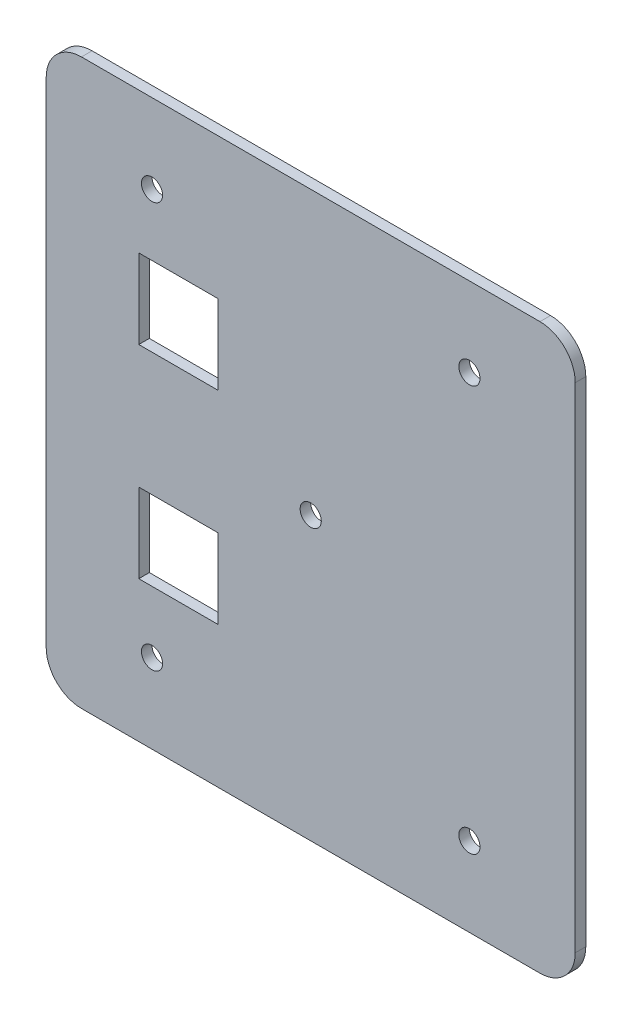
ISO-10303-21;
HEADER;
FILE_DESCRIPTION(('STEP AP214'),'2;1');
FILE_NAME('part.step','',(''),(''),'','','');
FILE_SCHEMA(('AUTOMOTIVE_DESIGN { 1 0 10303 214 1 1 1 1 }'));
ENDSEC;
DATA;
#1=APPLICATION_CONTEXT('core data for automotive mechanical design processes');
#2=APPLICATION_PROTOCOL_DEFINITION('international standard','automotive_design',2000,#1);
#3=PRODUCT_CONTEXT('',#1,'mechanical');
#4=PRODUCT('Part','Part','',(#3));
#5=PRODUCT_RELATED_PRODUCT_CATEGORY('part','',(#4));
#6=PRODUCT_DEFINITION_FORMATION('','',#4);
#7=PRODUCT_DEFINITION_CONTEXT('part definition',#1,'design');
#8=PRODUCT_DEFINITION('design','',#6,#7);
#9=PRODUCT_DEFINITION_SHAPE('','',#8);
#10=(LENGTH_UNIT() NAMED_UNIT(*) SI_UNIT(.MILLI.,.METRE.));
#11=(NAMED_UNIT(*) PLANE_ANGLE_UNIT() SI_UNIT($,.RADIAN.));
#12=(NAMED_UNIT(*) SI_UNIT($,.STERADIAN.) SOLID_ANGLE_UNIT());
#13=UNCERTAINTY_MEASURE_WITH_UNIT(LENGTH_MEASURE(1.E-05),#10,'distance_accuracy_value','');
#14=(GEOMETRIC_REPRESENTATION_CONTEXT(3) GLOBAL_UNCERTAINTY_ASSIGNED_CONTEXT((#13)) GLOBAL_UNIT_ASSIGNED_CONTEXT((#10,
#11,#12)) REPRESENTATION_CONTEXT('',''));
#15=CARTESIAN_POINT('',(0.,0.,0.));
#16=DIRECTION('',(0.,0.,1.));
#17=DIRECTION('',(1.,0.,0.));
#18=AXIS2_PLACEMENT_3D('',#15,#16,#17);
#19=CARTESIAN_POINT('',(-22.5,0.,6.));
#20=DIRECTION('',(1.,0.,0.));
#21=DIRECTION('',(0.,1.,0.));
#22=AXIS2_PLACEMENT_3D('',#19,#20,#21);
#23=PLANE('',#22);
#24=DIRECTION('',(0.,-1.,0.));
#25=VECTOR('',#24,1.);
#26=CARTESIAN_POINT('',(-22.5,0.,0.));
#27=LINE('',#26,#25);
#28=CARTESIAN_POINT('',(-22.5,22.5,0.));
#29=VERTEX_POINT('',#28);
#30=CARTESIAN_POINT('',(-22.5,-22.5,0.));
#31=VERTEX_POINT('',#30);
#32=EDGE_CURVE('E233',#29,#31,#27,.T.);
#33=ORIENTED_EDGE('',*,*,#32,.F.);
#34=DIRECTION('',(0.,0.,-1.));
#35=VECTOR('',#34,1.);
#36=CARTESIAN_POINT('',(-22.5,22.5,6.));
#37=LINE('',#36,#35);
#38=CARTESIAN_POINT('',(-22.5,22.5,6.));
#39=VERTEX_POINT('',#38);
#40=EDGE_CURVE('E11',#39,#29,#37,.T.);
#41=ORIENTED_EDGE('',*,*,#40,.F.);
#42=DIRECTION('',(0.,-1.,0.));
#43=VECTOR('',#42,1.);
#44=CARTESIAN_POINT('',(-22.5,0.,6.));
#45=LINE('',#44,#43);
#46=CARTESIAN_POINT('',(-22.5,-22.5,6.));
#47=VERTEX_POINT('',#46);
#48=EDGE_CURVE('E176',#39,#47,#45,.T.);
#49=ORIENTED_EDGE('',*,*,#48,.T.);
#50=DIRECTION('',(0.,0.,-1.));
#51=VECTOR('',#50,1.);
#52=CARTESIAN_POINT('',(-22.5,-22.5,6.));
#53=LINE('',#52,#51);
#54=EDGE_CURVE('E60',#47,#31,#53,.T.);
#55=ORIENTED_EDGE('',*,*,#54,.T.);
#56=EDGE_LOOP('',(#33,#41,#49,#55));
#57=FACE_BOUND('',#56,.T.);
#58=ADVANCED_FACE('F41',(#57),#23,.T.);
#59=CARTESIAN_POINT('',(0.,22.5,6.));
#60=DIRECTION('',(0.,-1.,0.));
#61=DIRECTION('',(0.,0.,-1.));
#62=AXIS2_PLACEMENT_3D('',#59,#60,#61);
#63=PLANE('',#62);
#64=DIRECTION('',(-1.,0.,0.));
#65=VECTOR('',#64,1.);
#66=CARTESIAN_POINT('',(0.,22.5,0.));
#67=LINE('',#66,#65);
#68=CARTESIAN_POINT('',(22.5,22.5,0.));
#69=VERTEX_POINT('',#68);
#70=EDGE_CURVE('E165',#69,#29,#67,.T.);
#71=ORIENTED_EDGE('',*,*,#70,.F.);
#72=DIRECTION('',(0.,0.,-1.));
#73=VECTOR('',#72,1.);
#74=CARTESIAN_POINT('',(22.5,22.5,6.));
#75=LINE('',#74,#73);
#76=CARTESIAN_POINT('',(22.5,22.5,6.));
#77=VERTEX_POINT('',#76);
#78=EDGE_CURVE('E51',#77,#69,#75,.T.);
#79=ORIENTED_EDGE('',*,*,#78,.F.);
#80=DIRECTION('',(-1.,0.,0.));
#81=VECTOR('',#80,1.);
#82=CARTESIAN_POINT('',(0.,22.5,6.));
#83=LINE('',#82,#81);
#84=EDGE_CURVE('E163',#77,#39,#83,.T.);
#85=ORIENTED_EDGE('',*,*,#84,.T.);
#86=ORIENTED_EDGE('',*,*,#40,.T.);
#87=EDGE_LOOP('',(#71,#79,#85,#86));
#88=FACE_BOUND('',#87,.T.);
#89=ADVANCED_FACE('F162',(#88),#63,.T.);
#90=CARTESIAN_POINT('',(22.5,0.,6.));
#91=DIRECTION('',(-1.,0.,0.));
#92=DIRECTION('',(0.,-1.,0.));
#93=AXIS2_PLACEMENT_3D('',#90,#91,#92);
#94=PLANE('',#93);
#95=DIRECTION('',(0.,1.,0.));
#96=VECTOR('',#95,1.);
#97=CARTESIAN_POINT('',(22.5,0.,0.));
#98=LINE('',#97,#96);
#99=CARTESIAN_POINT('',(22.5,-22.5,0.));
#100=VERTEX_POINT('',#99);
#101=EDGE_CURVE('E236',#100,#69,#98,.T.);
#102=ORIENTED_EDGE('',*,*,#101,.F.);
#103=DIRECTION('',(0.,0.,-1.));
#104=VECTOR('',#103,1.);
#105=CARTESIAN_POINT('',(22.5,-22.5,6.));
#106=LINE('',#105,#104);
#107=CARTESIAN_POINT('',(22.5,-22.5,6.));
#108=VERTEX_POINT('',#107);
#109=EDGE_CURVE('E109',#108,#100,#106,.T.);
#110=ORIENTED_EDGE('',*,*,#109,.F.);
#111=DIRECTION('',(0.,1.,0.));
#112=VECTOR('',#111,1.);
#113=CARTESIAN_POINT('',(22.5,0.,6.));
#114=LINE('',#113,#112);
#115=EDGE_CURVE('E175',#108,#77,#114,.T.);
#116=ORIENTED_EDGE('',*,*,#115,.T.);
#117=ORIENTED_EDGE('',*,*,#78,.T.);
#118=EDGE_LOOP('',(#102,#110,#116,#117));
#119=FACE_BOUND('',#118,.T.);
#120=ADVANCED_FACE('F178',(#119),#94,.T.);
#121=CARTESIAN_POINT('',(0.,92.5,6.));
#122=DIRECTION('',(0.,1.,0.));
#123=DIRECTION('',(0.,0.,1.));
#124=AXIS2_PLACEMENT_3D('',#121,#122,#123);
#125=PLANE('',#124);
#126=DIRECTION('',(1.,0.,0.));
#127=VECTOR('',#126,1.);
#128=CARTESIAN_POINT('',(0.,92.5,0.));
#129=LINE('',#128,#127);
#130=CARTESIAN_POINT('',(-22.5,92.5,0.));
#131=VERTEX_POINT('',#130);
#132=CARTESIAN_POINT('',(22.5,92.5,0.));
#133=VERTEX_POINT('',#132);
#134=EDGE_CURVE('E221',#131,#133,#129,.T.);
#135=ORIENTED_EDGE('',*,*,#134,.F.);
#136=DIRECTION('',(0.,0.,-1.));
#137=VECTOR('',#136,1.);
#138=CARTESIAN_POINT('',(-22.5,92.5,6.));
#139=LINE('',#138,#137);
#140=CARTESIAN_POINT('',(-22.5,92.5,6.));
#141=VERTEX_POINT('',#140);
#142=EDGE_CURVE('E243',#141,#131,#139,.T.);
#143=ORIENTED_EDGE('',*,*,#142,.F.);
#144=DIRECTION('',(1.,0.,0.));
#145=VECTOR('',#144,1.);
#146=CARTESIAN_POINT('',(0.,92.5,6.));
#147=LINE('',#146,#145);
#148=CARTESIAN_POINT('',(22.5,92.5,6.));
#149=VERTEX_POINT('',#148);
#150=EDGE_CURVE('E321',#141,#149,#147,.T.);
#151=ORIENTED_EDGE('',*,*,#150,.T.);
#152=DIRECTION('',(0.,0.,-1.));
#153=VECTOR('',#152,1.);
#154=CARTESIAN_POINT('',(22.5,92.5,6.));
#155=LINE('',#154,#153);
#156=EDGE_CURVE('E245',#149,#133,#155,.T.);
#157=ORIENTED_EDGE('',*,*,#156,.T.);
#158=EDGE_LOOP('',(#135,#143,#151,#157));
#159=FACE_BOUND('',#158,.T.);
#160=ADVANCED_FACE('F366',(#159),#125,.T.);
#161=CARTESIAN_POINT('',(-22.5,0.,6.));
#162=DIRECTION('',(1.,0.,0.));
#163=DIRECTION('',(0.,1.,0.));
#164=AXIS2_PLACEMENT_3D('',#161,#162,#163);
#165=PLANE('',#164);
#166=DIRECTION('',(0.,-1.,0.));
#167=VECTOR('',#166,1.);
#168=CARTESIAN_POINT('',(-22.5,0.,0.));
#169=LINE('',#168,#167);
#170=CARTESIAN_POINT('',(-22.5,137.5,0.));
#171=VERTEX_POINT('',#170);
#172=EDGE_CURVE('E224',#171,#131,#169,.T.);
#173=ORIENTED_EDGE('',*,*,#172,.F.);
#174=DIRECTION('',(0.,0.,-1.));
#175=VECTOR('',#174,1.);
#176=CARTESIAN_POINT('',(-22.5,137.5,6.));
#177=LINE('',#176,#175);
#178=CARTESIAN_POINT('',(-22.5,137.5,6.));
#179=VERTEX_POINT('',#178);
#180=EDGE_CURVE('E249',#179,#171,#177,.T.);
#181=ORIENTED_EDGE('',*,*,#180,.F.);
#182=DIRECTION('',(0.,-1.,0.));
#183=VECTOR('',#182,1.);
#184=CARTESIAN_POINT('',(-22.5,0.,6.));
#185=LINE('',#184,#183);
#186=EDGE_CURVE('E324',#179,#141,#185,.T.);
#187=ORIENTED_EDGE('',*,*,#186,.T.);
#188=ORIENTED_EDGE('',*,*,#142,.T.);
#189=EDGE_LOOP('',(#173,#181,#187,#188));
#190=FACE_BOUND('',#189,.T.);
#191=ADVANCED_FACE('F362',(#190),#165,.T.);
#192=CARTESIAN_POINT('',(0.,137.5,6.));
#193=DIRECTION('',(0.,-1.,0.));
#194=DIRECTION('',(0.,0.,-1.));
#195=AXIS2_PLACEMENT_3D('',#192,#193,#194);
#196=PLANE('',#195);
#197=DIRECTION('',(-1.,0.,0.));
#198=VECTOR('',#197,1.);
#199=CARTESIAN_POINT('',(0.,137.5,0.));
#200=LINE('',#199,#198);
#201=CARTESIAN_POINT('',(22.5,137.5,0.));
#202=VERTEX_POINT('',#201);
#203=EDGE_CURVE('E227',#202,#171,#200,.T.);
#204=ORIENTED_EDGE('',*,*,#203,.F.);
#205=DIRECTION('',(0.,0.,-1.));
#206=VECTOR('',#205,1.);
#207=CARTESIAN_POINT('',(22.5,137.5,6.));
#208=LINE('',#207,#206);
#209=CARTESIAN_POINT('',(22.5,137.5,6.));
#210=VERTEX_POINT('',#209);
#211=EDGE_CURVE('E247',#210,#202,#208,.T.);
#212=ORIENTED_EDGE('',*,*,#211,.F.);
#213=DIRECTION('',(-1.,0.,0.));
#214=VECTOR('',#213,1.);
#215=CARTESIAN_POINT('',(0.,137.5,6.));
#216=LINE('',#215,#214);
#217=EDGE_CURVE('E327',#210,#179,#216,.T.);
#218=ORIENTED_EDGE('',*,*,#217,.T.);
#219=ORIENTED_EDGE('',*,*,#180,.T.);
#220=EDGE_LOOP('',(#204,#212,#218,#219));
#221=FACE_BOUND('',#220,.T.);
#222=ADVANCED_FACE('F359',(#221),#196,.T.);
#223=CARTESIAN_POINT('',(0.,217.5,6.));
#224=DIRECTION('',(0.,1.,0.));
#225=DIRECTION('',(-1.,0.,0.));
#226=AXIS2_PLACEMENT_3D('',#223,#224,#225);
#227=PLANE('',#226);
#228=DIRECTION('',(1.,0.,0.));
#229=VECTOR('',#228,1.);
#230=CARTESIAN_POINT('',(0.,217.5,0.));
#231=LINE('',#230,#229);
#232=CARTESIAN_POINT('',(-54.9999999999999,217.5,0.));
#233=VERTEX_POINT('',#232);
#234=CARTESIAN_POINT('',(205.,217.5,0.));
#235=VERTEX_POINT('',#234);
#236=EDGE_CURVE('E185',#233,#235,#231,.T.);
#237=ORIENTED_EDGE('',*,*,#236,.F.);
#238=DIRECTION('',(0.,0.,-1.));
#239=VECTOR('',#238,1.);
#240=CARTESIAN_POINT('',(-54.9999999999999,217.5,6.));
#241=LINE('',#240,#239);
#242=CARTESIAN_POINT('',(-54.9999999999999,217.5,6.));
#243=VERTEX_POINT('',#242);
#244=EDGE_CURVE('E45',#243,#233,#241,.T.);
#245=ORIENTED_EDGE('',*,*,#244,.F.);
#246=DIRECTION('',(1.,0.,0.));
#247=VECTOR('',#246,1.);
#248=CARTESIAN_POINT('',(0.,217.5,6.));
#249=LINE('',#248,#247);
#250=CARTESIAN_POINT('',(205.,217.5,6.));
#251=VERTEX_POINT('',#250);
#252=EDGE_CURVE('E241',#243,#251,#249,.T.);
#253=ORIENTED_EDGE('',*,*,#252,.T.);
#254=DIRECTION('',(0.,0.,-1.));
#255=VECTOR('',#254,1.);
#256=CARTESIAN_POINT('',(205.,217.5,6.));
#257=LINE('',#256,#255);
#258=EDGE_CURVE('E181',#251,#235,#257,.T.);
#259=ORIENTED_EDGE('',*,*,#258,.T.);
#260=EDGE_LOOP('',(#237,#245,#253,#259));
#261=FACE_BOUND('',#260,.T.);
#262=ADVANCED_FACE('F43',(#261),#227,.T.);
#263=CARTESIAN_POINT('',(-55.,197.5,6.));
#264=DIRECTION('',(0.,0.,-1.));
#265=DIRECTION('',(-1.,0.,0.));
#266=AXIS2_PLACEMENT_3D('',#263,#264,#265);
#267=CYLINDRICAL_SURFACE('',#266,20.);
#268=CARTESIAN_POINT('',(-55.,197.5,0.));
#269=DIRECTION('',(0.,0.,1.));
#270=DIRECTION('',(1.,0.,0.));
#271=AXIS2_PLACEMENT_3D('',#268,#269,#270);
#272=CIRCLE('',#271,20.);
#273=CARTESIAN_POINT('',(-75.,197.5,0.));
#274=VERTEX_POINT('',#273);
#275=EDGE_CURVE('E188',#274,#233,#272,.F.);
#276=ORIENTED_EDGE('',*,*,#275,.F.);
#277=DIRECTION('',(0.,0.,-1.));
#278=VECTOR('',#277,1.);
#279=CARTESIAN_POINT('',(-75.,197.5,6.));
#280=LINE('',#279,#278);
#281=CARTESIAN_POINT('',(-75.,197.5,6.));
#282=VERTEX_POINT('',#281);
#283=EDGE_CURVE('E265',#282,#274,#280,.T.);
#284=ORIENTED_EDGE('',*,*,#283,.F.);
#285=CARTESIAN_POINT('',(-55.,197.5,6.));
#286=DIRECTION('',(0.,0.,1.));
#287=DIRECTION('',(1.,0.,0.));
#288=AXIS2_PLACEMENT_3D('',#285,#286,#287);
#289=CIRCLE('',#288,20.);
#290=EDGE_CURVE('E274',#282,#243,#289,.F.);
#291=ORIENTED_EDGE('',*,*,#290,.T.);
#292=ORIENTED_EDGE('',*,*,#244,.T.);
#293=EDGE_LOOP('',(#276,#284,#291,#292));
#294=FACE_BOUND('',#293,.T.);
#295=ADVANCED_FACE('F272',(#294),#267,.T.);
#296=CARTESIAN_POINT('',(-75.,0.,6.));
#297=DIRECTION('',(-1.,0.,0.));
#298=DIRECTION('',(0.,-1.,0.));
#299=AXIS2_PLACEMENT_3D('',#296,#297,#298);
#300=PLANE('',#299);
#301=DIRECTION('',(0.,1.,0.));
#302=VECTOR('',#301,1.);
#303=CARTESIAN_POINT('',(-75.,0.,0.));
#304=LINE('',#303,#302);
#305=CARTESIAN_POINT('',(-75.,-82.4999999999998,0.));
#306=VERTEX_POINT('',#305);
#307=EDGE_CURVE('E191',#306,#274,#304,.T.);
#308=ORIENTED_EDGE('',*,*,#307,.F.);
#309=DIRECTION('',(0.,0.,-1.));
#310=VECTOR('',#309,1.);
#311=CARTESIAN_POINT('',(-75.,-82.4999999999998,6.));
#312=LINE('',#311,#310);
#313=CARTESIAN_POINT('',(-75.,-82.4999999999998,6.));
#314=VERTEX_POINT('',#313);
#315=EDGE_CURVE('E264',#314,#306,#312,.T.);
#316=ORIENTED_EDGE('',*,*,#315,.F.);
#317=DIRECTION('',(0.,1.,0.));
#318=VECTOR('',#317,1.);
#319=CARTESIAN_POINT('',(-75.,0.,6.));
#320=LINE('',#319,#318);
#321=EDGE_CURVE('E284',#314,#282,#320,.T.);
#322=ORIENTED_EDGE('',*,*,#321,.T.);
#323=ORIENTED_EDGE('',*,*,#283,.T.);
#324=EDGE_LOOP('',(#308,#316,#322,#323));
#325=FACE_BOUND('',#324,.T.);
#326=ADVANCED_FACE('F281',(#325),#300,.T.);
#327=CARTESIAN_POINT('',(-55.,-82.5,6.));
#328=DIRECTION('',(0.,0.,-1.));
#329=DIRECTION('',(-1.,0.,0.));
#330=AXIS2_PLACEMENT_3D('',#327,#328,#329);
#331=CYLINDRICAL_SURFACE('',#330,20.);
#332=CARTESIAN_POINT('',(-55.,-82.5,0.));
#333=DIRECTION('',(0.,0.,1.));
#334=DIRECTION('',(1.,0.,0.));
#335=AXIS2_PLACEMENT_3D('',#332,#333,#334);
#336=CIRCLE('',#335,20.);
#337=CARTESIAN_POINT('',(-54.9999999999998,-102.5,0.));
#338=VERTEX_POINT('',#337);
#339=EDGE_CURVE('E194',#306,#338,#336,.T.);
#340=ORIENTED_EDGE('',*,*,#339,.T.);
#341=DIRECTION('',(0.,0.,-1.));
#342=VECTOR('',#341,1.);
#343=CARTESIAN_POINT('',(-54.9999999999998,-102.5,6.));
#344=LINE('',#343,#342);
#345=CARTESIAN_POINT('',(-54.9999999999998,-102.5,6.));
#346=VERTEX_POINT('',#345);
#347=EDGE_CURVE('E261',#346,#338,#344,.T.);
#348=ORIENTED_EDGE('',*,*,#347,.F.);
#349=CARTESIAN_POINT('',(-55.,-82.5,6.));
#350=DIRECTION('',(0.,0.,1.));
#351=DIRECTION('',(1.,0.,0.));
#352=AXIS2_PLACEMENT_3D('',#349,#350,#351);
#353=CIRCLE('',#352,20.);
#354=EDGE_CURVE('E287',#314,#346,#353,.T.);
#355=ORIENTED_EDGE('',*,*,#354,.F.);
#356=ORIENTED_EDGE('',*,*,#315,.T.);
#357=EDGE_LOOP('',(#340,#348,#355,#356));
#358=FACE_BOUND('',#357,.T.);
#359=ADVANCED_FACE('F288',(#358),#331,.T.);
#360=CARTESIAN_POINT('',(0.,-102.5,6.));
#361=DIRECTION('',(0.,1.,0.));
#362=DIRECTION('',(-1.,0.,0.));
#363=AXIS2_PLACEMENT_3D('',#360,#361,#362);
#364=PLANE('',#363);
#365=DIRECTION('',(1.,0.,0.));
#366=VECTOR('',#365,1.);
#367=CARTESIAN_POINT('',(0.,-102.5,0.));
#368=LINE('',#367,#366);
#369=CARTESIAN_POINT('',(205.,-102.5,0.));
#370=VERTEX_POINT('',#369);
#371=EDGE_CURVE('E196',#338,#370,#368,.T.);
#372=ORIENTED_EDGE('',*,*,#371,.T.);
#373=DIRECTION('',(0.,0.,-1.));
#374=VECTOR('',#373,1.);
#375=CARTESIAN_POINT('',(205.,-102.5,6.));
#376=LINE('',#375,#374);
#377=CARTESIAN_POINT('',(205.,-102.5,6.));
#378=VERTEX_POINT('',#377);
#379=EDGE_CURVE('E258',#378,#370,#376,.T.);
#380=ORIENTED_EDGE('',*,*,#379,.F.);
#381=DIRECTION('',(1.,0.,0.));
#382=VECTOR('',#381,1.);
#383=CARTESIAN_POINT('',(0.,-102.5,6.));
#384=LINE('',#383,#382);
#385=EDGE_CURVE('E291',#346,#378,#384,.T.);
#386=ORIENTED_EDGE('',*,*,#385,.F.);
#387=ORIENTED_EDGE('',*,*,#347,.T.);
#388=EDGE_LOOP('',(#372,#380,#386,#387));
#389=FACE_BOUND('',#388,.T.);
#390=ADVANCED_FACE('F395',(#389),#364,.F.);
#391=CARTESIAN_POINT('',(205.,-82.5,6.));
#392=DIRECTION('',(0.,0.,-1.));
#393=DIRECTION('',(-1.,0.,0.));
#394=AXIS2_PLACEMENT_3D('',#391,#392,#393);
#395=CYLINDRICAL_SURFACE('',#394,20.);
#396=CARTESIAN_POINT('',(205.,-82.5,0.));
#397=DIRECTION('',(0.,0.,1.));
#398=DIRECTION('',(1.,0.,0.));
#399=AXIS2_PLACEMENT_3D('',#396,#397,#398);
#400=CIRCLE('',#399,20.);
#401=CARTESIAN_POINT('',(225.,-82.4999999999998,0.));
#402=VERTEX_POINT('',#401);
#403=EDGE_CURVE('E198',#370,#402,#400,.T.);
#404=ORIENTED_EDGE('',*,*,#403,.T.);
#405=DIRECTION('',(0.,0.,-1.));
#406=VECTOR('',#405,1.);
#407=CARTESIAN_POINT('',(225.,-82.4999999999998,6.));
#408=LINE('',#407,#406);
#409=CARTESIAN_POINT('',(225.,-82.4999999999998,6.));
#410=VERTEX_POINT('',#409);
#411=EDGE_CURVE('E255',#410,#402,#408,.T.);
#412=ORIENTED_EDGE('',*,*,#411,.F.);
#413=CARTESIAN_POINT('',(205.,-82.5,6.));
#414=DIRECTION('',(0.,0.,1.));
#415=DIRECTION('',(1.,0.,0.));
#416=AXIS2_PLACEMENT_3D('',#413,#414,#415);
#417=CIRCLE('',#416,20.);
#418=EDGE_CURVE('E299',#378,#410,#417,.T.);
#419=ORIENTED_EDGE('',*,*,#418,.F.);
#420=ORIENTED_EDGE('',*,*,#379,.T.);
#421=EDGE_LOOP('',(#404,#412,#419,#420));
#422=FACE_BOUND('',#421,.T.);
#423=ADVANCED_FACE('F391',(#422),#395,.T.);
#424=CARTESIAN_POINT('',(225.,0.,6.));
#425=DIRECTION('',(-1.,0.,0.));
#426=DIRECTION('',(0.,0.,1.));
#427=AXIS2_PLACEMENT_3D('',#424,#425,#426);
#428=PLANE('',#427);
#429=DIRECTION('',(0.,1.,0.));
#430=VECTOR('',#429,1.);
#431=CARTESIAN_POINT('',(225.,0.,0.));
#432=LINE('',#431,#430);
#433=CARTESIAN_POINT('',(225.,197.5,0.));
#434=VERTEX_POINT('',#433);
#435=EDGE_CURVE('E200',#402,#434,#432,.T.);
#436=ORIENTED_EDGE('',*,*,#435,.T.);
#437=DIRECTION('',(0.,0.,-1.));
#438=VECTOR('',#437,1.);
#439=CARTESIAN_POINT('',(225.,197.5,6.));
#440=LINE('',#439,#438);
#441=CARTESIAN_POINT('',(225.,197.5,6.));
#442=VERTEX_POINT('',#441);
#443=EDGE_CURVE('E253',#442,#434,#440,.T.);
#444=ORIENTED_EDGE('',*,*,#443,.F.);
#445=DIRECTION('',(0.,1.,0.));
#446=VECTOR('',#445,1.);
#447=CARTESIAN_POINT('',(225.,0.,6.));
#448=LINE('',#447,#446);
#449=EDGE_CURVE('E301',#410,#442,#448,.T.);
#450=ORIENTED_EDGE('',*,*,#449,.F.);
#451=ORIENTED_EDGE('',*,*,#411,.T.);
#452=EDGE_LOOP('',(#436,#444,#450,#451));
#453=FACE_BOUND('',#452,.T.);
#454=ADVANCED_FACE('F357',(#453),#428,.F.);
#455=CARTESIAN_POINT('',(22.5,0.,6.));
#456=DIRECTION('',(-1.,0.,0.));
#457=DIRECTION('',(0.,-1.,0.));
#458=AXIS2_PLACEMENT_3D('',#455,#456,#457);
#459=PLANE('',#458);
#460=DIRECTION('',(0.,1.,0.));
#461=VECTOR('',#460,1.);
#462=CARTESIAN_POINT('',(22.5,0.,0.));
#463=LINE('',#462,#461);
#464=EDGE_CURVE('E230',#133,#202,#463,.T.);
#465=ORIENTED_EDGE('',*,*,#464,.F.);
#466=ORIENTED_EDGE('',*,*,#156,.F.);
#467=DIRECTION('',(0.,1.,0.));
#468=VECTOR('',#467,1.);
#469=CARTESIAN_POINT('',(22.5,0.,6.));
#470=LINE('',#469,#468);
#471=EDGE_CURVE('E330',#149,#210,#470,.T.);
#472=ORIENTED_EDGE('',*,*,#471,.T.);
#473=ORIENTED_EDGE('',*,*,#211,.T.);
#474=EDGE_LOOP('',(#465,#466,#472,#473));
#475=FACE_BOUND('',#474,.T.);
#476=ADVANCED_FACE('F353',(#475),#459,.T.);
#477=CARTESIAN_POINT('',(165.,172.5,6.));
#478=DIRECTION('',(0.,0.,-1.));
#479=DIRECTION('',(-1.,0.,0.));
#480=AXIS2_PLACEMENT_3D('',#477,#478,#479);
#481=CYLINDRICAL_SURFACE('',#480,6.00000000000002);
#482=CARTESIAN_POINT('',(165.,172.5,6.));
#483=DIRECTION('',(0.,0.,1.));
#484=DIRECTION('',(1.,0.,0.));
#485=AXIS2_PLACEMENT_3D('',#482,#483,#484);
#486=CIRCLE('',#485,6.00000000000002);
#487=CARTESIAN_POINT('',(171.,172.5,6.));
#488=VERTEX_POINT('',#487);
#489=EDGE_CURVE('E318',#488,#488,#486,.T.);
#490=ORIENTED_EDGE('',*,*,#489,.T.);
#491=EDGE_LOOP('',(#490));
#492=FACE_BOUND('',#491,.T.);
#493=CARTESIAN_POINT('',(165.,172.5,0.));
#494=DIRECTION('',(0.,0.,1.));
#495=DIRECTION('',(1.,0.,0.));
#496=AXIS2_PLACEMENT_3D('',#493,#494,#495);
#497=CIRCLE('',#496,6.00000000000002);
#498=CARTESIAN_POINT('',(171.,172.5,0.));
#499=VERTEX_POINT('',#498);
#500=EDGE_CURVE('E218',#499,#499,#497,.T.);
#501=ORIENTED_EDGE('',*,*,#500,.F.);
#502=EDGE_LOOP('',(#501));
#503=FACE_BOUND('',#502,.T.);
#504=ADVANCED_FACE('F356',(#492,#503),#481,.F.);
#505=CARTESIAN_POINT('',(165.,-57.4999999999999,6.));
#506=DIRECTION('',(0.,0.,-1.));
#507=DIRECTION('',(-1.,0.,0.));
#508=AXIS2_PLACEMENT_3D('',#505,#506,#507);
#509=CYLINDRICAL_SURFACE('',#508,6.00000000000002);
#510=CARTESIAN_POINT('',(165.,-57.4999999999999,6.));
#511=DIRECTION('',(0.,0.,1.));
#512=DIRECTION('',(1.,0.,0.));
#513=AXIS2_PLACEMENT_3D('',#510,#511,#512);
#514=CIRCLE('',#513,6.00000000000002);
#515=CARTESIAN_POINT('',(171.,-57.4999999999999,6.));
#516=VERTEX_POINT('',#515);
#517=EDGE_CURVE('E315',#516,#516,#514,.T.);
#518=ORIENTED_EDGE('',*,*,#517,.T.);
#519=EDGE_LOOP('',(#518));
#520=FACE_BOUND('',#519,.T.);
#521=CARTESIAN_POINT('',(165.,-57.4999999999999,0.));
#522=DIRECTION('',(0.,0.,1.));
#523=DIRECTION('',(1.,0.,0.));
#524=AXIS2_PLACEMENT_3D('',#521,#522,#523);
#525=CIRCLE('',#524,6.00000000000002);
#526=CARTESIAN_POINT('',(171.,-57.4999999999999,0.));
#527=VERTEX_POINT('',#526);
#528=EDGE_CURVE('E215',#527,#527,#525,.T.);
#529=ORIENTED_EDGE('',*,*,#528,.F.);
#530=EDGE_LOOP('',(#529));
#531=FACE_BOUND('',#530,.T.);
#532=ADVANCED_FACE('F373',(#520,#531),#509,.F.);
#533=CARTESIAN_POINT('',(-15.,-57.4999999999999,6.));
#534=DIRECTION('',(0.,0.,-1.));
#535=DIRECTION('',(-1.,0.,0.));
#536=AXIS2_PLACEMENT_3D('',#533,#534,#535);
#537=CYLINDRICAL_SURFACE('',#536,6.);
#538=CARTESIAN_POINT('',(-15.,-57.4999999999999,6.));
#539=DIRECTION('',(0.,0.,1.));
#540=DIRECTION('',(1.,0.,0.));
#541=AXIS2_PLACEMENT_3D('',#538,#539,#540);
#542=CIRCLE('',#541,6.);
#543=CARTESIAN_POINT('',(-9.00000000000001,-57.4999999999999,6.));
#544=VERTEX_POINT('',#543);
#545=EDGE_CURVE('E312',#544,#544,#542,.T.);
#546=ORIENTED_EDGE('',*,*,#545,.T.);
#547=EDGE_LOOP('',(#546));
#548=FACE_BOUND('',#547,.T.);
#549=CARTESIAN_POINT('',(-15.,-57.4999999999999,0.));
#550=DIRECTION('',(0.,0.,1.));
#551=DIRECTION('',(1.,0.,0.));
#552=AXIS2_PLACEMENT_3D('',#549,#550,#551);
#553=CIRCLE('',#552,6.);
#554=CARTESIAN_POINT('',(-9.00000000000001,-57.4999999999999,0.));
#555=VERTEX_POINT('',#554);
#556=EDGE_CURVE('E212',#555,#555,#553,.T.);
#557=ORIENTED_EDGE('',*,*,#556,.F.);
#558=EDGE_LOOP('',(#557));
#559=FACE_BOUND('',#558,.T.);
#560=ADVANCED_FACE('F377',(#548,#559),#537,.F.);
#561=CARTESIAN_POINT('',(75.,57.5,6.));
#562=DIRECTION('',(0.,0.,-1.));
#563=DIRECTION('',(-1.,0.,0.));
#564=AXIS2_PLACEMENT_3D('',#561,#562,#563);
#565=CYLINDRICAL_SURFACE('',#564,5.99999999999999);
#566=CARTESIAN_POINT('',(75.,57.5,6.));
#567=DIRECTION('',(0.,0.,1.));
#568=DIRECTION('',(1.,0.,0.));
#569=AXIS2_PLACEMENT_3D('',#566,#567,#568);
#570=CIRCLE('',#569,5.99999999999999);
#571=CARTESIAN_POINT('',(81.,57.5,6.));
#572=VERTEX_POINT('',#571);
#573=EDGE_CURVE('E309',#572,#572,#570,.T.);
#574=ORIENTED_EDGE('',*,*,#573,.T.);
#575=EDGE_LOOP('',(#574));
#576=FACE_BOUND('',#575,.T.);
#577=CARTESIAN_POINT('',(75.,57.5,0.));
#578=DIRECTION('',(0.,0.,1.));
#579=DIRECTION('',(1.,0.,0.));
#580=AXIS2_PLACEMENT_3D('',#577,#578,#579);
#581=CIRCLE('',#580,5.99999999999999);
#582=CARTESIAN_POINT('',(81.,57.5,0.));
#583=VERTEX_POINT('',#582);
#584=EDGE_CURVE('E209',#583,#583,#581,.T.);
#585=ORIENTED_EDGE('',*,*,#584,.F.);
#586=EDGE_LOOP('',(#585));
#587=FACE_BOUND('',#586,.T.);
#588=ADVANCED_FACE('F381',(#576,#587),#565,.F.);
#589=CARTESIAN_POINT('',(-15.,172.5,6.));
#590=DIRECTION('',(0.,0.,-1.));
#591=DIRECTION('',(-1.,0.,0.));
#592=AXIS2_PLACEMENT_3D('',#589,#590,#591);
#593=CYLINDRICAL_SURFACE('',#592,6.);
#594=CARTESIAN_POINT('',(-15.,172.5,6.));
#595=DIRECTION('',(0.,0.,1.));
#596=DIRECTION('',(1.,0.,0.));
#597=AXIS2_PLACEMENT_3D('',#594,#595,#596);
#598=CIRCLE('',#597,6.);
#599=CARTESIAN_POINT('',(-9.00000000000001,172.5,6.));
#600=VERTEX_POINT('',#599);
#601=EDGE_CURVE('E306',#600,#600,#598,.T.);
#602=ORIENTED_EDGE('',*,*,#601,.T.);
#603=EDGE_LOOP('',(#602));
#604=FACE_BOUND('',#603,.T.);
#605=CARTESIAN_POINT('',(-15.,172.5,0.));
#606=DIRECTION('',(0.,0.,1.));
#607=DIRECTION('',(1.,0.,0.));
#608=AXIS2_PLACEMENT_3D('',#605,#606,#607);
#609=CIRCLE('',#608,6.);
#610=CARTESIAN_POINT('',(-9.00000000000001,172.5,0.));
#611=VERTEX_POINT('',#610);
#612=EDGE_CURVE('E206',#611,#611,#609,.T.);
#613=ORIENTED_EDGE('',*,*,#612,.F.);
#614=EDGE_LOOP('',(#613));
#615=FACE_BOUND('',#614,.T.);
#616=ADVANCED_FACE('F341',(#604,#615),#593,.F.);
#617=CARTESIAN_POINT('',(205.,197.5,6.));
#618=DIRECTION('',(0.,0.,-1.));
#619=DIRECTION('',(-1.,0.,0.));
#620=AXIS2_PLACEMENT_3D('',#617,#618,#619);
#621=CYLINDRICAL_SURFACE('',#620,20.);
#622=CARTESIAN_POINT('',(205.,197.5,0.));
#623=DIRECTION('',(0.,0.,1.));
#624=DIRECTION('',(1.,0.,0.));
#625=AXIS2_PLACEMENT_3D('',#622,#623,#624);
#626=CIRCLE('',#625,20.);
#627=EDGE_CURVE('E203',#235,#434,#626,.F.);
#628=ORIENTED_EDGE('',*,*,#627,.F.);
#629=ORIENTED_EDGE('',*,*,#258,.F.);
#630=CARTESIAN_POINT('',(205.,197.5,6.));
#631=DIRECTION('',(0.,0.,1.));
#632=DIRECTION('',(1.,0.,0.));
#633=AXIS2_PLACEMENT_3D('',#630,#631,#632);
#634=CIRCLE('',#633,20.);
#635=EDGE_CURVE('E303',#251,#442,#634,.F.);
#636=ORIENTED_EDGE('',*,*,#635,.T.);
#637=ORIENTED_EDGE('',*,*,#443,.T.);
#638=EDGE_LOOP('',(#628,#629,#636,#637));
#639=FACE_BOUND('',#638,.T.);
#640=ADVANCED_FACE('F334',(#639),#621,.T.);
#641=CARTESIAN_POINT('',(0.,-22.5,6.));
#642=DIRECTION('',(0.,1.,0.));
#643=DIRECTION('',(0.,0.,1.));
#644=AXIS2_PLACEMENT_3D('',#641,#642,#643);
#645=PLANE('',#644);
#646=DIRECTION('',(1.,0.,0.));
#647=VECTOR('',#646,1.);
#648=CARTESIAN_POINT('',(0.,-22.5,0.));
#649=LINE('',#648,#647);
#650=EDGE_CURVE('E238',#31,#100,#649,.T.);
#651=ORIENTED_EDGE('',*,*,#650,.F.);
#652=ORIENTED_EDGE('',*,*,#54,.F.);
#653=DIRECTION('',(1.,0.,0.));
#654=VECTOR('',#653,1.);
#655=CARTESIAN_POINT('',(0.,-22.5,6.));
#656=LINE('',#655,#654);
#657=EDGE_CURVE('E179',#47,#108,#656,.T.);
#658=ORIENTED_EDGE('',*,*,#657,.T.);
#659=ORIENTED_EDGE('',*,*,#109,.T.);
#660=EDGE_LOOP('',(#651,#652,#658,#659));
#661=FACE_BOUND('',#660,.T.);
#662=ADVANCED_FACE('F332',(#661),#645,.T.);
#663=CARTESIAN_POINT('',(0.,0.,6.));
#664=DIRECTION('',(0.,0.,1.));
#665=DIRECTION('',(1.,0.,0.));
#666=AXIS2_PLACEMENT_3D('',#663,#664,#665);
#667=PLANE('',#666);
#668=ORIENTED_EDGE('',*,*,#252,.F.);
#669=ORIENTED_EDGE('',*,*,#290,.F.);
#670=ORIENTED_EDGE('',*,*,#321,.F.);
#671=ORIENTED_EDGE('',*,*,#354,.T.);
#672=ORIENTED_EDGE('',*,*,#385,.T.);
#673=ORIENTED_EDGE('',*,*,#418,.T.);
#674=ORIENTED_EDGE('',*,*,#449,.T.);
#675=ORIENTED_EDGE('',*,*,#635,.F.);
#676=EDGE_LOOP('',(#668,#669,#670,#671,#672,#673,#674,#675));
#677=FACE_BOUND('',#676,.T.);
#678=ORIENTED_EDGE('',*,*,#601,.F.);
#679=EDGE_LOOP('',(#678));
#680=FACE_BOUND('',#679,.T.);
#681=ORIENTED_EDGE('',*,*,#573,.F.);
#682=EDGE_LOOP('',(#681));
#683=FACE_BOUND('',#682,.T.);
#684=ORIENTED_EDGE('',*,*,#545,.F.);
#685=EDGE_LOOP('',(#684));
#686=FACE_BOUND('',#685,.T.);
#687=ORIENTED_EDGE('',*,*,#517,.F.);
#688=EDGE_LOOP('',(#687));
#689=FACE_BOUND('',#688,.T.);
#690=ORIENTED_EDGE('',*,*,#489,.F.);
#691=EDGE_LOOP('',(#690));
#692=FACE_BOUND('',#691,.T.);
#693=ORIENTED_EDGE('',*,*,#150,.F.);
#694=ORIENTED_EDGE('',*,*,#186,.F.);
#695=ORIENTED_EDGE('',*,*,#217,.F.);
#696=ORIENTED_EDGE('',*,*,#471,.F.);
#697=EDGE_LOOP('',(#693,#694,#695,#696));
#698=FACE_BOUND('',#697,.T.);
#699=ORIENTED_EDGE('',*,*,#48,.F.);
#700=ORIENTED_EDGE('',*,*,#84,.F.);
#701=ORIENTED_EDGE('',*,*,#115,.F.);
#702=ORIENTED_EDGE('',*,*,#657,.F.);
#703=EDGE_LOOP('',(#699,#700,#701,#702));
#704=FACE_BOUND('',#703,.T.);
#705=ADVANCED_FACE('F173',(#677,#680,#683,#686,#689,#692,#698,#704),#667,.T.);
#706=CARTESIAN_POINT('',(0.,0.,0.));
#707=DIRECTION('',(0.,0.,1.));
#708=DIRECTION('',(1.,0.,0.));
#709=AXIS2_PLACEMENT_3D('',#706,#707,#708);
#710=PLANE('',#709);
#711=ORIENTED_EDGE('',*,*,#236,.T.);
#712=ORIENTED_EDGE('',*,*,#627,.T.);
#713=ORIENTED_EDGE('',*,*,#435,.F.);
#714=ORIENTED_EDGE('',*,*,#403,.F.);
#715=ORIENTED_EDGE('',*,*,#371,.F.);
#716=ORIENTED_EDGE('',*,*,#339,.F.);
#717=ORIENTED_EDGE('',*,*,#307,.T.);
#718=ORIENTED_EDGE('',*,*,#275,.T.);
#719=EDGE_LOOP('',(#711,#712,#713,#714,#715,#716,#717,#718));
#720=FACE_BOUND('',#719,.T.);
#721=ORIENTED_EDGE('',*,*,#612,.T.);
#722=EDGE_LOOP('',(#721));
#723=FACE_BOUND('',#722,.T.);
#724=ORIENTED_EDGE('',*,*,#584,.T.);
#725=EDGE_LOOP('',(#724));
#726=FACE_BOUND('',#725,.T.);
#727=ORIENTED_EDGE('',*,*,#556,.T.);
#728=EDGE_LOOP('',(#727));
#729=FACE_BOUND('',#728,.T.);
#730=ORIENTED_EDGE('',*,*,#528,.T.);
#731=EDGE_LOOP('',(#730));
#732=FACE_BOUND('',#731,.T.);
#733=ORIENTED_EDGE('',*,*,#500,.T.);
#734=EDGE_LOOP('',(#733));
#735=FACE_BOUND('',#734,.T.);
#736=ORIENTED_EDGE('',*,*,#134,.T.);
#737=ORIENTED_EDGE('',*,*,#464,.T.);
#738=ORIENTED_EDGE('',*,*,#203,.T.);
#739=ORIENTED_EDGE('',*,*,#172,.T.);
#740=EDGE_LOOP('',(#736,#737,#738,#739));
#741=FACE_BOUND('',#740,.T.);
#742=ORIENTED_EDGE('',*,*,#32,.T.);
#743=ORIENTED_EDGE('',*,*,#650,.T.);
#744=ORIENTED_EDGE('',*,*,#101,.T.);
#745=ORIENTED_EDGE('',*,*,#70,.T.);
#746=EDGE_LOOP('',(#742,#743,#744,#745));
#747=FACE_BOUND('',#746,.T.);
#748=ADVANCED_FACE('F277',(#720,#723,#726,#729,#732,#735,#741,#747),#710,.F.);
#749=CLOSED_SHELL('',(#58,#89,#120,#160,#191,#222,#262,#295,#326,#359,#390,#423,#454,#476,#504,
#532,#560,#588,#616,#640,#662,#705,#748));
#750=MANIFOLD_SOLID_BREP('B2',#749);
#751=ADVANCED_BREP_SHAPE_REPRESENTATION('',(#18,#750),#14);
#752=SHAPE_DEFINITION_REPRESENTATION(#9,#751);
ENDSEC;
END-ISO-10303-21;
